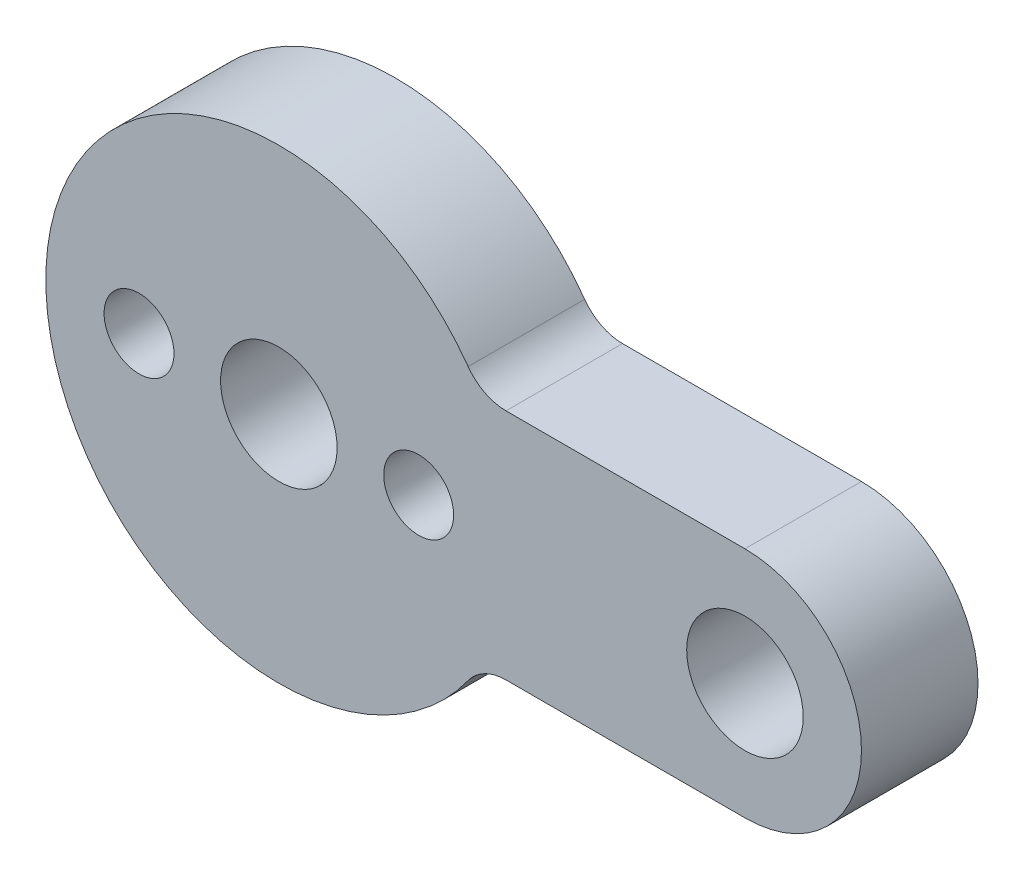
ISO-10303-21;
HEADER;
FILE_DESCRIPTION(('STEP AP214'),'2;1');
FILE_NAME('part.step','',(''),(''),'','','');
FILE_SCHEMA(('AUTOMOTIVE_DESIGN { 1 0 10303 214 1 1 1 1 }'));
ENDSEC;
DATA;
#1=APPLICATION_CONTEXT('core data for automotive mechanical design processes');
#2=APPLICATION_PROTOCOL_DEFINITION('international standard','automotive_design',2000,#1);
#3=PRODUCT_CONTEXT('',#1,'mechanical');
#4=PRODUCT('Part','Part','',(#3));
#5=PRODUCT_RELATED_PRODUCT_CATEGORY('part','',(#4));
#6=PRODUCT_DEFINITION_FORMATION('','',#4);
#7=PRODUCT_DEFINITION_CONTEXT('part definition',#1,'design');
#8=PRODUCT_DEFINITION('design','',#6,#7);
#9=PRODUCT_DEFINITION_SHAPE('','',#8);
#10=(LENGTH_UNIT() NAMED_UNIT(*) SI_UNIT(.MILLI.,.METRE.));
#11=(NAMED_UNIT(*) PLANE_ANGLE_UNIT() SI_UNIT($,.RADIAN.));
#12=(NAMED_UNIT(*) SI_UNIT($,.STERADIAN.) SOLID_ANGLE_UNIT());
#13=UNCERTAINTY_MEASURE_WITH_UNIT(LENGTH_MEASURE(1.E-05),#10,'distance_accuracy_value','');
#14=(GEOMETRIC_REPRESENTATION_CONTEXT(3) GLOBAL_UNCERTAINTY_ASSIGNED_CONTEXT((#13)) GLOBAL_UNIT_ASSIGNED_CONTEXT((#10,
#11,#12)) REPRESENTATION_CONTEXT('',''));
#15=CARTESIAN_POINT('',(0.,0.,0.));
#16=DIRECTION('',(0.,0.,1.));
#17=DIRECTION('',(1.,0.,0.));
#18=AXIS2_PLACEMENT_3D('',#15,#16,#17);
#19=CARTESIAN_POINT('',(0.,0.,5.));
#20=DIRECTION('',(0.,0.,-1.));
#21=DIRECTION('',(-1.,0.,0.));
#22=AXIS2_PLACEMENT_3D('',#19,#20,#21);
#23=CYLINDRICAL_SURFACE('',#22,5.);
#24=CARTESIAN_POINT('',(0.,0.,0.));
#25=DIRECTION('',(0.,0.,-1.));
#26=DIRECTION('',(-1.,0.,0.));
#27=AXIS2_PLACEMENT_3D('',#24,#25,#26);
#28=CIRCLE('',#27,5.);
#29=CARTESIAN_POINT('',(0.,5.,0.));
#30=VERTEX_POINT('',#29);
#31=CARTESIAN_POINT('',(0.,-5.,0.));
#32=VERTEX_POINT('',#31);
#33=EDGE_CURVE('E87',#30,#32,#28,.T.);
#34=ORIENTED_EDGE('',*,*,#33,.F.);
#35=DIRECTION('',(0.,0.,-1.));
#36=VECTOR('',#35,1.);
#37=CARTESIAN_POINT('',(0.,5.,5.));
#38=LINE('',#37,#36);
#39=CARTESIAN_POINT('',(0.,5.,5.));
#40=VERTEX_POINT('',#39);
#41=EDGE_CURVE('E91',#40,#30,#38,.T.);
#42=ORIENTED_EDGE('',*,*,#41,.F.);
#43=CARTESIAN_POINT('',(0.,0.,5.));
#44=DIRECTION('',(0.,0.,1.));
#45=DIRECTION('',(1.,0.,0.));
#46=AXIS2_PLACEMENT_3D('',#43,#44,#45);
#47=CIRCLE('',#46,5.);
#48=CARTESIAN_POINT('',(0.,-5.,5.));
#49=VERTEX_POINT('',#48);
#50=EDGE_CURVE('E146',#49,#40,#47,.T.);
#51=ORIENTED_EDGE('',*,*,#50,.F.);
#52=DIRECTION('',(0.,0.,-1.));
#53=VECTOR('',#52,1.);
#54=CARTESIAN_POINT('',(0.,-5.,5.));
#55=LINE('',#54,#53);
#56=EDGE_CURVE('E93',#49,#32,#55,.T.);
#57=ORIENTED_EDGE('',*,*,#56,.T.);
#58=EDGE_LOOP('',(#34,#42,#51,#57));
#59=FACE_BOUND('',#58,.T.);
#60=ADVANCED_FACE('F34',(#59),#23,.T.);
#61=CARTESIAN_POINT('',(0.,0.,5.));
#62=DIRECTION('',(0.,0.,-1.));
#63=DIRECTION('',(-1.,0.,0.));
#64=AXIS2_PLACEMENT_3D('',#61,#62,#63);
#65=CYLINDRICAL_SURFACE('',#64,2.5);
#66=CARTESIAN_POINT('',(0.,0.,5.));
#67=DIRECTION('',(0.,0.,1.));
#68=DIRECTION('',(1.,0.,0.));
#69=AXIS2_PLACEMENT_3D('',#66,#67,#68);
#70=CIRCLE('',#69,2.5);
#71=CARTESIAN_POINT('',(2.5,0.,5.));
#72=VERTEX_POINT('',#71);
#73=EDGE_CURVE('E153',#72,#72,#70,.T.);
#74=ORIENTED_EDGE('',*,*,#73,.T.);
#75=EDGE_LOOP('',(#74));
#76=FACE_BOUND('',#75,.T.);
#77=CARTESIAN_POINT('',(0.,0.,0.));
#78=DIRECTION('',(0.,0.,-1.));
#79=DIRECTION('',(-1.,0.,0.));
#80=AXIS2_PLACEMENT_3D('',#77,#78,#79);
#81=CIRCLE('',#80,2.5);
#82=CARTESIAN_POINT('',(-2.5,0.,0.));
#83=VERTEX_POINT('',#82);
#84=EDGE_CURVE('E38',#83,#83,#81,.T.);
#85=ORIENTED_EDGE('',*,*,#84,.T.);
#86=EDGE_LOOP('',(#85));
#87=FACE_BOUND('',#86,.T.);
#88=ADVANCED_FACE('F172',(#76,#87),#65,.F.);
#89=CARTESIAN_POINT('',(0.,0.,0.));
#90=DIRECTION('',(0.,0.,1.));
#91=DIRECTION('',(1.,0.,0.));
#92=AXIS2_PLACEMENT_3D('',#89,#90,#91);
#93=PLANE('',#92);
#94=CARTESIAN_POINT('',(-20.,0.,0.));
#95=DIRECTION('',(0.,0.,1.));
#96=DIRECTION('',(1.,0.,0.));
#97=AXIS2_PLACEMENT_3D('',#94,#95,#96);
#98=CIRCLE('',#97,2.5);
#99=CARTESIAN_POINT('',(-17.5,0.,0.));
#100=VERTEX_POINT('',#99);
#101=EDGE_CURVE('E150',#100,#100,#98,.T.);
#102=ORIENTED_EDGE('',*,*,#101,.T.);
#103=EDGE_LOOP('',(#102));
#104=FACE_BOUND('',#103,.T.);
#105=CARTESIAN_POINT('',(-14.,0.,0.));
#106=DIRECTION('',(0.,0.,1.));
#107=DIRECTION('',(1.,0.,0.));
#108=AXIS2_PLACEMENT_3D('',#105,#106,#107);
#109=CIRCLE('',#108,1.5);
#110=CARTESIAN_POINT('',(-12.5,0.,0.));
#111=VERTEX_POINT('',#110);
#112=EDGE_CURVE('E161',#111,#111,#109,.T.);
#113=ORIENTED_EDGE('',*,*,#112,.T.);
#114=EDGE_LOOP('',(#113));
#115=FACE_BOUND('',#114,.T.);
#116=CARTESIAN_POINT('',(-26.,0.,0.));
#117=DIRECTION('',(0.,0.,1.));
#118=DIRECTION('',(1.,0.,0.));
#119=AXIS2_PLACEMENT_3D('',#116,#117,#118);
#120=CIRCLE('',#119,1.5);
#121=CARTESIAN_POINT('',(-24.5,0.,0.));
#122=VERTEX_POINT('',#121);
#123=EDGE_CURVE('E158',#122,#122,#120,.T.);
#124=ORIENTED_EDGE('',*,*,#123,.T.);
#125=EDGE_LOOP('',(#124));
#126=FACE_BOUND('',#125,.T.);
#127=CARTESIAN_POINT('',(-20.,0.,0.));
#128=DIRECTION('',(0.,0.,1.));
#129=DIRECTION('',(1.,0.,0.));
#130=AXIS2_PLACEMENT_3D('',#127,#128,#129);
#131=CIRCLE('',#130,10.);
#132=CARTESIAN_POINT('',(-11.8776713793259,5.83333333333333,0.));
#133=VERTEX_POINT('',#132);
#134=CARTESIAN_POINT('',(-11.8776713793259,-5.83333333333333,0.));
#135=VERTEX_POINT('',#134);
#136=EDGE_CURVE('E57',#133,#135,#131,.T.);
#137=ORIENTED_EDGE('',*,*,#136,.F.);
#138=CARTESIAN_POINT('',(-10.253205655191,7.,0.));
#139=DIRECTION('',(0.,0.,1.));
#140=DIRECTION('',(1.,0.,0.));
#141=AXIS2_PLACEMENT_3D('',#138,#139,#140);
#142=CIRCLE('',#141,2.);
#143=CARTESIAN_POINT('',(-10.253205655191,5.,0.));
#144=VERTEX_POINT('',#143);
#145=EDGE_CURVE('E11',#133,#144,#142,.T.);
#146=ORIENTED_EDGE('',*,*,#145,.T.);
#147=DIRECTION('',(-1.,0.,0.));
#148=VECTOR('',#147,1.);
#149=CARTESIAN_POINT('',(0.,5.,0.));
#150=LINE('',#149,#148);
#151=EDGE_CURVE('E98',#30,#144,#150,.T.);
#152=ORIENTED_EDGE('',*,*,#151,.F.);
#153=ORIENTED_EDGE('',*,*,#33,.T.);
#154=DIRECTION('',(1.,0.,0.));
#155=VECTOR('',#154,1.);
#156=CARTESIAN_POINT('',(0.,-5.,0.));
#157=LINE('',#156,#155);
#158=CARTESIAN_POINT('',(-10.253205655191,-5.,0.));
#159=VERTEX_POINT('',#158);
#160=EDGE_CURVE('E105',#159,#32,#157,.T.);
#161=ORIENTED_EDGE('',*,*,#160,.F.);
#162=CARTESIAN_POINT('',(-10.253205655191,-7.,0.));
#163=DIRECTION('',(0.,0.,1.));
#164=DIRECTION('',(1.,0.,0.));
#165=AXIS2_PLACEMENT_3D('',#162,#163,#164);
#166=CIRCLE('',#165,2.);
#167=EDGE_CURVE('E126',#159,#135,#166,.T.);
#168=ORIENTED_EDGE('',*,*,#167,.T.);
#169=EDGE_LOOP('',(#137,#146,#152,#153,#161,#168));
#170=FACE_BOUND('',#169,.T.);
#171=ORIENTED_EDGE('',*,*,#84,.F.);
#172=EDGE_LOOP('',(#171));
#173=FACE_BOUND('',#172,.T.);
#174=ADVANCED_FACE('F99',(#104,#115,#126,#170,#173),#93,.F.);
#175=CARTESIAN_POINT('',(0.,0.,5.));
#176=DIRECTION('',(0.,0.,1.));
#177=DIRECTION('',(1.,0.,0.));
#178=AXIS2_PLACEMENT_3D('',#175,#176,#177);
#179=PLANE('',#178);
#180=ORIENTED_EDGE('',*,*,#73,.F.);
#181=EDGE_LOOP('',(#180));
#182=FACE_BOUND('',#181,.T.);
#183=CARTESIAN_POINT('',(-20.,0.,5.));
#184=DIRECTION('',(0.,0.,1.));
#185=DIRECTION('',(1.,0.,0.));
#186=AXIS2_PLACEMENT_3D('',#183,#184,#185);
#187=CIRCLE('',#186,2.5);
#188=CARTESIAN_POINT('',(-17.5,0.,5.));
#189=VERTEX_POINT('',#188);
#190=EDGE_CURVE('E106',#189,#189,#187,.T.);
#191=ORIENTED_EDGE('',*,*,#190,.F.);
#192=EDGE_LOOP('',(#191));
#193=FACE_BOUND('',#192,.T.);
#194=CARTESIAN_POINT('',(-14.,0.,5.));
#195=DIRECTION('',(0.,0.,1.));
#196=DIRECTION('',(1.,0.,0.));
#197=AXIS2_PLACEMENT_3D('',#194,#195,#196);
#198=CIRCLE('',#197,1.5);
#199=CARTESIAN_POINT('',(-12.5,0.,5.));
#200=VERTEX_POINT('',#199);
#201=EDGE_CURVE('E137',#200,#200,#198,.T.);
#202=ORIENTED_EDGE('',*,*,#201,.F.);
#203=EDGE_LOOP('',(#202));
#204=FACE_BOUND('',#203,.T.);
#205=CARTESIAN_POINT('',(-26.,0.,5.));
#206=DIRECTION('',(0.,0.,1.));
#207=DIRECTION('',(1.,0.,0.));
#208=AXIS2_PLACEMENT_3D('',#205,#206,#207);
#209=CIRCLE('',#208,1.5);
#210=CARTESIAN_POINT('',(-24.5,0.,5.));
#211=VERTEX_POINT('',#210);
#212=EDGE_CURVE('E164',#211,#211,#209,.T.);
#213=ORIENTED_EDGE('',*,*,#212,.F.);
#214=EDGE_LOOP('',(#213));
#215=FACE_BOUND('',#214,.T.);
#216=CARTESIAN_POINT('',(-10.253205655191,7.,5.));
#217=DIRECTION('',(0.,0.,1.));
#218=DIRECTION('',(1.,0.,0.));
#219=AXIS2_PLACEMENT_3D('',#216,#217,#218);
#220=CIRCLE('',#219,2.);
#221=CARTESIAN_POINT('',(-10.253205655191,5.,5.));
#222=VERTEX_POINT('',#221);
#223=CARTESIAN_POINT('',(-11.8776713793259,5.83333333333333,5.));
#224=VERTEX_POINT('',#223);
#225=EDGE_CURVE('E43',#222,#224,#220,.F.);
#226=ORIENTED_EDGE('',*,*,#225,.T.);
#227=CARTESIAN_POINT('',(-20.,0.,5.));
#228=DIRECTION('',(0.,0.,1.));
#229=DIRECTION('',(1.,0.,0.));
#230=AXIS2_PLACEMENT_3D('',#227,#228,#229);
#231=CIRCLE('',#230,10.);
#232=CARTESIAN_POINT('',(-11.8776713793259,-5.83333333333333,5.));
#233=VERTEX_POINT('',#232);
#234=EDGE_CURVE('E50',#224,#233,#231,.T.);
#235=ORIENTED_EDGE('',*,*,#234,.T.);
#236=CARTESIAN_POINT('',(-10.253205655191,-7.,5.));
#237=DIRECTION('',(0.,0.,1.));
#238=DIRECTION('',(1.,0.,0.));
#239=AXIS2_PLACEMENT_3D('',#236,#237,#238);
#240=CIRCLE('',#239,2.);
#241=CARTESIAN_POINT('',(-10.253205655191,-5.,5.));
#242=VERTEX_POINT('',#241);
#243=EDGE_CURVE('E128',#233,#242,#240,.F.);
#244=ORIENTED_EDGE('',*,*,#243,.T.);
#245=DIRECTION('',(1.,0.,0.));
#246=VECTOR('',#245,1.);
#247=CARTESIAN_POINT('',(0.,-5.,5.));
#248=LINE('',#247,#246);
#249=EDGE_CURVE('E116',#242,#49,#248,.T.);
#250=ORIENTED_EDGE('',*,*,#249,.T.);
#251=ORIENTED_EDGE('',*,*,#50,.T.);
#252=DIRECTION('',(-1.,0.,0.));
#253=VECTOR('',#252,1.);
#254=CARTESIAN_POINT('',(0.,5.,5.));
#255=LINE('',#254,#253);
#256=EDGE_CURVE('E110',#40,#222,#255,.T.);
#257=ORIENTED_EDGE('',*,*,#256,.T.);
#258=EDGE_LOOP('',(#226,#235,#244,#250,#251,#257));
#259=FACE_BOUND('',#258,.T.);
#260=ADVANCED_FACE('F132',(#182,#193,#204,#215,#259),#179,.T.);
#261=CARTESIAN_POINT('',(0.,5.,5.));
#262=DIRECTION('',(0.,-1.,0.));
#263=DIRECTION('',(1.,0.,0.));
#264=AXIS2_PLACEMENT_3D('',#261,#262,#263);
#265=PLANE('',#264);
#266=ORIENTED_EDGE('',*,*,#151,.T.);
#267=DIRECTION('',(0.,0.,1.));
#268=VECTOR('',#267,1.);
#269=CARTESIAN_POINT('',(-10.253205655191,5.,5.));
#270=LINE('',#269,#268);
#271=EDGE_CURVE('E122',#144,#222,#270,.T.);
#272=ORIENTED_EDGE('',*,*,#271,.T.);
#273=ORIENTED_EDGE('',*,*,#256,.F.);
#274=ORIENTED_EDGE('',*,*,#41,.T.);
#275=EDGE_LOOP('',(#266,#272,#273,#274));
#276=FACE_BOUND('',#275,.T.);
#277=ADVANCED_FACE('F108',(#276),#265,.F.);
#278=CARTESIAN_POINT('',(0.,-5.,5.));
#279=DIRECTION('',(0.,1.,0.));
#280=DIRECTION('',(-1.,0.,0.));
#281=AXIS2_PLACEMENT_3D('',#278,#279,#280);
#282=PLANE('',#281);
#283=ORIENTED_EDGE('',*,*,#249,.F.);
#284=DIRECTION('',(0.,0.,1.));
#285=VECTOR('',#284,1.);
#286=CARTESIAN_POINT('',(-10.253205655191,-5.,5.));
#287=LINE('',#286,#285);
#288=EDGE_CURVE('E114',#242,#159,#287,.F.);
#289=ORIENTED_EDGE('',*,*,#288,.T.);
#290=ORIENTED_EDGE('',*,*,#160,.T.);
#291=ORIENTED_EDGE('',*,*,#56,.F.);
#292=EDGE_LOOP('',(#283,#289,#290,#291));
#293=FACE_BOUND('',#292,.T.);
#294=ADVANCED_FACE('F144',(#293),#282,.F.);
#295=CARTESIAN_POINT('',(-20.,0.,5.));
#296=DIRECTION('',(0.,0.,-1.));
#297=DIRECTION('',(-1.,0.,0.));
#298=AXIS2_PLACEMENT_3D('',#295,#296,#297);
#299=CYLINDRICAL_SURFACE('',#298,2.5);
#300=ORIENTED_EDGE('',*,*,#190,.T.);
#301=EDGE_LOOP('',(#300));
#302=FACE_BOUND('',#301,.T.);
#303=ORIENTED_EDGE('',*,*,#101,.F.);
#304=EDGE_LOOP('',(#303));
#305=FACE_BOUND('',#304,.T.);
#306=ADVANCED_FACE('F206',(#302,#305),#299,.F.);
#307=CARTESIAN_POINT('',(-14.,0.,-8.));
#308=DIRECTION('',(0.,0.,1.));
#309=DIRECTION('',(1.,0.,0.));
#310=AXIS2_PLACEMENT_3D('',#307,#308,#309);
#311=CYLINDRICAL_SURFACE('',#310,1.5);
#312=CARTESIAN_POINT('',(-12.5,0.,5.));
#313=CARTESIAN_POINT('',(-12.5,0.,4.94791666666667));
#314=CARTESIAN_POINT('',(-12.5,0.,4.89583333333333));
#315=CARTESIAN_POINT('',(-12.5,0.,4.79166666666667));
#316=CARTESIAN_POINT('',(-12.5,0.,4.73958333333333));
#317=CARTESIAN_POINT('',(-12.5,0.,4.63541666666667));
#318=CARTESIAN_POINT('',(-12.5,0.,4.58333333333333));
#319=CARTESIAN_POINT('',(-12.5,0.,4.47916666666667));
#320=CARTESIAN_POINT('',(-12.5,0.,4.42708333333333));
#321=CARTESIAN_POINT('',(-12.5,0.,4.32291666666667));
#322=CARTESIAN_POINT('',(-12.5,0.,4.27083333333333));
#323=CARTESIAN_POINT('',(-12.5,0.,4.16666666666667));
#324=CARTESIAN_POINT('',(-12.5,0.,4.11458333333333));
#325=CARTESIAN_POINT('',(-12.5,0.,4.01041666666666));
#326=CARTESIAN_POINT('',(-12.5,0.,3.95833333333333));
#327=CARTESIAN_POINT('',(-12.5,0.,3.85416666666667));
#328=CARTESIAN_POINT('',(-12.5,0.,3.80208333333333));
#329=CARTESIAN_POINT('',(-12.5,0.,3.69791666666666));
#330=CARTESIAN_POINT('',(-12.5,0.,3.64583333333333));
#331=CARTESIAN_POINT('',(-12.5,0.,3.54166666666667));
#332=CARTESIAN_POINT('',(-12.5,0.,3.48958333333333));
#333=CARTESIAN_POINT('',(-12.5,0.,3.38541666666667));
#334=CARTESIAN_POINT('',(-12.5,0.,3.33333333333333));
#335=CARTESIAN_POINT('',(-12.5,0.,3.22916666666667));
#336=CARTESIAN_POINT('',(-12.5,0.,3.17708333333333));
#337=CARTESIAN_POINT('',(-12.5,0.,3.07291666666667));
#338=CARTESIAN_POINT('',(-12.5,0.,3.02083333333333));
#339=CARTESIAN_POINT('',(-12.5,0.,2.91666666666667));
#340=CARTESIAN_POINT('',(-12.5,0.,2.86458333333333));
#341=CARTESIAN_POINT('',(-12.5,0.,2.76041666666667));
#342=CARTESIAN_POINT('',(-12.5,0.,2.70833333333333));
#343=CARTESIAN_POINT('',(-12.5,0.,2.60416666666667));
#344=CARTESIAN_POINT('',(-12.5,0.,2.55208333333333));
#345=CARTESIAN_POINT('',(-12.5,0.,2.44791666666667));
#346=CARTESIAN_POINT('',(-12.5,0.,2.39583333333333));
#347=CARTESIAN_POINT('',(-12.5,0.,2.29166666666667));
#348=CARTESIAN_POINT('',(-12.5,0.,2.23958333333333));
#349=CARTESIAN_POINT('',(-12.5,0.,2.13541666666667));
#350=CARTESIAN_POINT('',(-12.5,0.,2.08333333333333));
#351=CARTESIAN_POINT('',(-12.5,0.,1.97916666666667));
#352=CARTESIAN_POINT('',(-12.5,0.,1.92708333333333));
#353=CARTESIAN_POINT('',(-12.5,0.,1.82291666666666));
#354=CARTESIAN_POINT('',(-12.5,0.,1.77083333333333));
#355=CARTESIAN_POINT('',(-12.5,0.,1.66666666666667));
#356=CARTESIAN_POINT('',(-12.5,0.,1.61458333333333));
#357=CARTESIAN_POINT('',(-12.5,0.,1.51041666666667));
#358=CARTESIAN_POINT('',(-12.5,0.,1.45833333333333));
#359=CARTESIAN_POINT('',(-12.5,0.,1.35416666666667));
#360=CARTESIAN_POINT('',(-12.5,0.,1.30208333333333));
#361=CARTESIAN_POINT('',(-12.5,0.,1.19791666666667));
#362=CARTESIAN_POINT('',(-12.5,0.,1.14583333333333));
#363=CARTESIAN_POINT('',(-12.5,0.,1.04166666666667));
#364=CARTESIAN_POINT('',(-12.5,0.,0.989583333333333));
#365=CARTESIAN_POINT('',(-12.5,0.,0.885416666666666));
#366=CARTESIAN_POINT('',(-12.5,0.,0.833333333333332));
#367=CARTESIAN_POINT('',(-12.5,0.,0.729166666666666));
#368=CARTESIAN_POINT('',(-12.5,0.,0.677083333333332));
#369=CARTESIAN_POINT('',(-12.5,0.,0.572916666666666));
#370=CARTESIAN_POINT('',(-12.5,0.,0.520833333333332));
#371=CARTESIAN_POINT('',(-12.5,0.,0.416666666666665));
#372=CARTESIAN_POINT('',(-12.5,0.,0.364583333333332));
#373=CARTESIAN_POINT('',(-12.5,0.,0.260416666666665));
#374=CARTESIAN_POINT('',(-12.5,0.,0.208333333333332));
#375=CARTESIAN_POINT('',(-12.5,0.,0.104166666666665));
#376=CARTESIAN_POINT('',(-12.5,0.,0.0520833333333317));
#377=CARTESIAN_POINT('',(-12.5,0.,0.));
#378=B_SPLINE_CURVE_WITH_KNOTS('',3,(#312,#313,#314,#315,#316,#317,#318,#319,#320,#321,#322,
#323,#324,#325,#326,#327,#328,#329,#330,#331,#332,#333,#334,#335,#336,#337,#338,#339,#340,#341,
#342,#343,#344,#345,#346,#347,#348,#349,#350,#351,#352,#353,#354,#355,#356,#357,#358,#359,#360,
#361,#362,#363,#364,#365,#366,#367,#368,#369,#370,#371,#372,#373,#374,#375,#376,#377),
.UNSPECIFIED.,.F.,.F.,(4,2,2,2,2,2,2,2,2,2,2,2,2,2,2,2,2,2,2,2,2,2,2,2,2,2,2,2,2,2,2,2,4),(0.,
0.15625,0.3125,0.46875,0.625000000000001,0.781250000000001,0.937500000000001,1.09375,1.25,
1.40625,1.5625,1.71875,1.875,2.03125,2.1875,2.34375,2.5,2.65625,2.8125,2.96875,3.125,3.28125,
3.4375,3.59375,3.75,3.90625,4.0625,4.21875,4.375,4.53125,4.6875,4.84375,5.),.UNSPECIFIED.);
#379=EDGE_CURVE('BSEAM201',#200,#111,#378,.T.);
#380=ORIENTED_EDGE('',*,*,#201,.T.);
#381=ORIENTED_EDGE('',*,*,#112,.F.);
#382=ORIENTED_EDGE('',*,*,#379,.T.);
#383=ORIENTED_EDGE('',*,*,#379,.F.);
#384=EDGE_LOOP('',(#380,#382,#381,#383));
#385=FACE_BOUND('',#384,.T.);
#386=ADVANCED_FACE('F201',(#385),#311,.F.);
#387=CARTESIAN_POINT('',(-26.,0.,-8.));
#388=DIRECTION('',(0.,0.,1.));
#389=DIRECTION('',(1.,0.,0.));
#390=AXIS2_PLACEMENT_3D('',#387,#388,#389);
#391=CYLINDRICAL_SURFACE('',#390,1.5);
#392=CARTESIAN_POINT('',(-24.5,0.,5.));
#393=CARTESIAN_POINT('',(-24.5,0.,4.94791666666667));
#394=CARTESIAN_POINT('',(-24.5,0.,4.89583333333333));
#395=CARTESIAN_POINT('',(-24.5,0.,4.79166666666667));
#396=CARTESIAN_POINT('',(-24.5,0.,4.73958333333333));
#397=CARTESIAN_POINT('',(-24.5,0.,4.63541666666667));
#398=CARTESIAN_POINT('',(-24.5,0.,4.58333333333333));
#399=CARTESIAN_POINT('',(-24.5,0.,4.47916666666667));
#400=CARTESIAN_POINT('',(-24.5,0.,4.42708333333333));
#401=CARTESIAN_POINT('',(-24.5,0.,4.32291666666667));
#402=CARTESIAN_POINT('',(-24.5,0.,4.27083333333333));
#403=CARTESIAN_POINT('',(-24.5,0.,4.16666666666667));
#404=CARTESIAN_POINT('',(-24.5,0.,4.11458333333333));
#405=CARTESIAN_POINT('',(-24.5,0.,4.01041666666666));
#406=CARTESIAN_POINT('',(-24.5,0.,3.95833333333333));
#407=CARTESIAN_POINT('',(-24.5,0.,3.85416666666667));
#408=CARTESIAN_POINT('',(-24.5,0.,3.80208333333333));
#409=CARTESIAN_POINT('',(-24.5,0.,3.69791666666666));
#410=CARTESIAN_POINT('',(-24.5,0.,3.64583333333333));
#411=CARTESIAN_POINT('',(-24.5,0.,3.54166666666667));
#412=CARTESIAN_POINT('',(-24.5,0.,3.48958333333333));
#413=CARTESIAN_POINT('',(-24.5,0.,3.38541666666667));
#414=CARTESIAN_POINT('',(-24.5,0.,3.33333333333333));
#415=CARTESIAN_POINT('',(-24.5,0.,3.22916666666667));
#416=CARTESIAN_POINT('',(-24.5,0.,3.17708333333333));
#417=CARTESIAN_POINT('',(-24.5,0.,3.07291666666667));
#418=CARTESIAN_POINT('',(-24.5,0.,3.02083333333333));
#419=CARTESIAN_POINT('',(-24.5,0.,2.91666666666667));
#420=CARTESIAN_POINT('',(-24.5,0.,2.86458333333333));
#421=CARTESIAN_POINT('',(-24.5,0.,2.76041666666667));
#422=CARTESIAN_POINT('',(-24.5,0.,2.70833333333333));
#423=CARTESIAN_POINT('',(-24.5,0.,2.60416666666667));
#424=CARTESIAN_POINT('',(-24.5,0.,2.55208333333333));
#425=CARTESIAN_POINT('',(-24.5,0.,2.44791666666667));
#426=CARTESIAN_POINT('',(-24.5,0.,2.39583333333333));
#427=CARTESIAN_POINT('',(-24.5,0.,2.29166666666667));
#428=CARTESIAN_POINT('',(-24.5,0.,2.23958333333333));
#429=CARTESIAN_POINT('',(-24.5,0.,2.13541666666667));
#430=CARTESIAN_POINT('',(-24.5,0.,2.08333333333333));
#431=CARTESIAN_POINT('',(-24.5,0.,1.97916666666667));
#432=CARTESIAN_POINT('',(-24.5,0.,1.92708333333333));
#433=CARTESIAN_POINT('',(-24.5,0.,1.82291666666666));
#434=CARTESIAN_POINT('',(-24.5,0.,1.77083333333333));
#435=CARTESIAN_POINT('',(-24.5,0.,1.66666666666667));
#436=CARTESIAN_POINT('',(-24.5,0.,1.61458333333333));
#437=CARTESIAN_POINT('',(-24.5,0.,1.51041666666667));
#438=CARTESIAN_POINT('',(-24.5,0.,1.45833333333333));
#439=CARTESIAN_POINT('',(-24.5,0.,1.35416666666667));
#440=CARTESIAN_POINT('',(-24.5,0.,1.30208333333333));
#441=CARTESIAN_POINT('',(-24.5,0.,1.19791666666667));
#442=CARTESIAN_POINT('',(-24.5,0.,1.14583333333333));
#443=CARTESIAN_POINT('',(-24.5,0.,1.04166666666667));
#444=CARTESIAN_POINT('',(-24.5,0.,0.989583333333333));
#445=CARTESIAN_POINT('',(-24.5,0.,0.885416666666666));
#446=CARTESIAN_POINT('',(-24.5,0.,0.833333333333332));
#447=CARTESIAN_POINT('',(-24.5,0.,0.729166666666666));
#448=CARTESIAN_POINT('',(-24.5,0.,0.677083333333332));
#449=CARTESIAN_POINT('',(-24.5,0.,0.572916666666666));
#450=CARTESIAN_POINT('',(-24.5,0.,0.520833333333332));
#451=CARTESIAN_POINT('',(-24.5,0.,0.416666666666665));
#452=CARTESIAN_POINT('',(-24.5,0.,0.364583333333332));
#453=CARTESIAN_POINT('',(-24.5,0.,0.260416666666665));
#454=CARTESIAN_POINT('',(-24.5,0.,0.208333333333332));
#455=CARTESIAN_POINT('',(-24.5,0.,0.104166666666665));
#456=CARTESIAN_POINT('',(-24.5,0.,0.0520833333333317));
#457=CARTESIAN_POINT('',(-24.5,0.,0.));
#458=B_SPLINE_CURVE_WITH_KNOTS('',3,(#392,#393,#394,#395,#396,#397,#398,#399,#400,#401,#402,
#403,#404,#405,#406,#407,#408,#409,#410,#411,#412,#413,#414,#415,#416,#417,#418,#419,#420,#421,
#422,#423,#424,#425,#426,#427,#428,#429,#430,#431,#432,#433,#434,#435,#436,#437,#438,#439,#440,
#441,#442,#443,#444,#445,#446,#447,#448,#449,#450,#451,#452,#453,#454,#455,#456,#457),
.UNSPECIFIED.,.F.,.F.,(4,2,2,2,2,2,2,2,2,2,2,2,2,2,2,2,2,2,2,2,2,2,2,2,2,2,2,2,2,2,2,2,4),(0.,
0.15625,0.3125,0.46875,0.625000000000001,0.781250000000001,0.937500000000001,1.09375,1.25,
1.40625,1.5625,1.71875,1.875,2.03125,2.1875,2.34375,2.5,2.65625,2.8125,2.96875,3.125,3.28125,
3.4375,3.59375,3.75,3.90625,4.0625,4.21875,4.375,4.53125,4.6875,4.84375,5.),.UNSPECIFIED.);
#459=EDGE_CURVE('BSEAM196',#211,#122,#458,.T.);
#460=ORIENTED_EDGE('',*,*,#212,.T.);
#461=ORIENTED_EDGE('',*,*,#123,.F.);
#462=ORIENTED_EDGE('',*,*,#459,.T.);
#463=ORIENTED_EDGE('',*,*,#459,.F.);
#464=EDGE_LOOP('',(#460,#462,#461,#463));
#465=FACE_BOUND('',#464,.T.);
#466=ADVANCED_FACE('F196',(#465),#391,.F.);
#467=CARTESIAN_POINT('',(-20.,0.,0.));
#468=DIRECTION('',(0.,0.,1.));
#469=DIRECTION('',(1.,0.,0.));
#470=AXIS2_PLACEMENT_3D('',#467,#468,#469);
#471=CYLINDRICAL_SURFACE('',#470,10.);
#472=ORIENTED_EDGE('',*,*,#234,.F.);
#473=DIRECTION('',(0.,0.,1.));
#474=VECTOR('',#473,1.);
#475=CARTESIAN_POINT('',(-11.8776713793259,5.83333333333333,0.));
#476=LINE('',#475,#474);
#477=EDGE_CURVE('E124',#224,#133,#476,.F.);
#478=ORIENTED_EDGE('',*,*,#477,.T.);
#479=ORIENTED_EDGE('',*,*,#136,.T.);
#480=DIRECTION('',(0.,0.,1.));
#481=VECTOR('',#480,1.);
#482=CARTESIAN_POINT('',(-11.8776713793259,-5.83333333333334,0.));
#483=LINE('',#482,#481);
#484=EDGE_CURVE('E112',#135,#233,#483,.T.);
#485=ORIENTED_EDGE('',*,*,#484,.T.);
#486=EDGE_LOOP('',(#472,#478,#479,#485));
#487=FACE_BOUND('',#486,.T.);
#488=ADVANCED_FACE('F135',(#487),#471,.T.);
#489=CARTESIAN_POINT('',(-10.253205655191,-7.,0.));
#490=DIRECTION('',(0.,0.,1.));
#491=DIRECTION('',(1.,0.,0.));
#492=AXIS2_PLACEMENT_3D('',#489,#490,#491);
#493=CYLINDRICAL_SURFACE('',#492,2.);
#494=ORIENTED_EDGE('',*,*,#243,.F.);
#495=ORIENTED_EDGE('',*,*,#484,.F.);
#496=ORIENTED_EDGE('',*,*,#167,.F.);
#497=ORIENTED_EDGE('',*,*,#288,.F.);
#498=EDGE_LOOP('',(#494,#495,#496,#497));
#499=FACE_BOUND('',#498,.T.);
#500=ADVANCED_FACE('F140',(#499),#493,.F.);
#501=CARTESIAN_POINT('',(-10.253205655191,7.,0.));
#502=DIRECTION('',(0.,0.,1.));
#503=DIRECTION('',(1.,0.,0.));
#504=AXIS2_PLACEMENT_3D('',#501,#502,#503);
#505=CYLINDRICAL_SURFACE('',#504,2.);
#506=ORIENTED_EDGE('',*,*,#145,.F.);
#507=ORIENTED_EDGE('',*,*,#477,.F.);
#508=ORIENTED_EDGE('',*,*,#225,.F.);
#509=ORIENTED_EDGE('',*,*,#271,.F.);
#510=EDGE_LOOP('',(#506,#507,#508,#509));
#511=FACE_BOUND('',#510,.T.);
#512=ADVANCED_FACE('F36',(#511),#505,.F.);
#513=CLOSED_SHELL('',(#60,#88,#174,#260,#277,#294,#306,#386,#466,#488,#500,#512));
#514=MANIFOLD_SOLID_BREP('B2',#513);
#515=ADVANCED_BREP_SHAPE_REPRESENTATION('',(#18,#514),#14);
#516=SHAPE_DEFINITION_REPRESENTATION(#9,#515);
ENDSEC;
END-ISO-10303-21;
